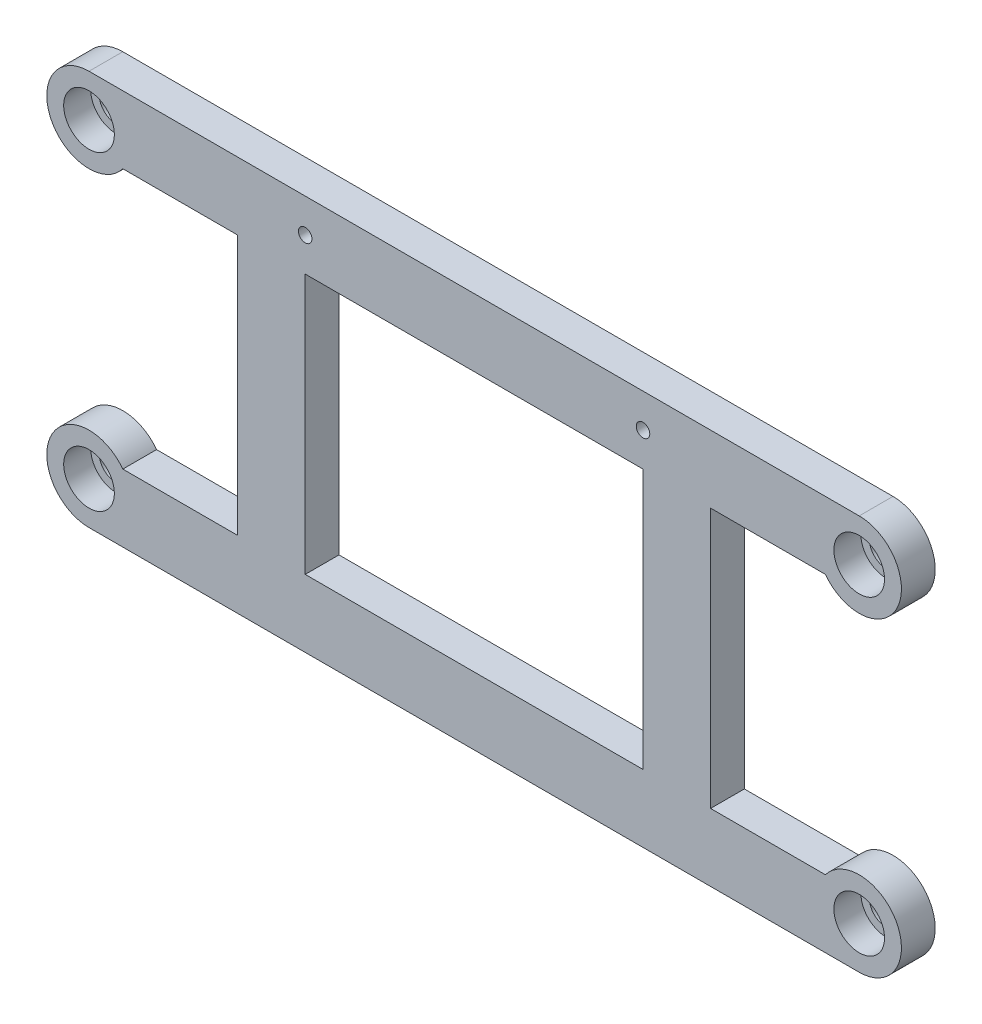
ISO-10303-21;
HEADER;
FILE_DESCRIPTION(('STEP AP214'),'2;1');
FILE_NAME('part.step','',(''),(''),'','','');
FILE_SCHEMA(('AUTOMOTIVE_DESIGN { 1 0 10303 214 1 1 1 1 }'));
ENDSEC;
DATA;
#1=APPLICATION_CONTEXT('core data for automotive mechanical design processes');
#2=APPLICATION_PROTOCOL_DEFINITION('international standard','automotive_design',2000,#1);
#3=PRODUCT_CONTEXT('',#1,'mechanical');
#4=PRODUCT('Part','Part','',(#3));
#5=PRODUCT_RELATED_PRODUCT_CATEGORY('part','',(#4));
#6=PRODUCT_DEFINITION_FORMATION('','',#4);
#7=PRODUCT_DEFINITION_CONTEXT('part definition',#1,'design');
#8=PRODUCT_DEFINITION('design','',#6,#7);
#9=PRODUCT_DEFINITION_SHAPE('','',#8);
#10=(LENGTH_UNIT() NAMED_UNIT(*) SI_UNIT(.MILLI.,.METRE.));
#11=(NAMED_UNIT(*) PLANE_ANGLE_UNIT() SI_UNIT($,.RADIAN.));
#12=(NAMED_UNIT(*) SI_UNIT($,.STERADIAN.) SOLID_ANGLE_UNIT());
#13=UNCERTAINTY_MEASURE_WITH_UNIT(LENGTH_MEASURE(1.E-05),#10,'distance_accuracy_value','');
#14=(GEOMETRIC_REPRESENTATION_CONTEXT(3) GLOBAL_UNCERTAINTY_ASSIGNED_CONTEXT((#13)) GLOBAL_UNIT_ASSIGNED_CONTEXT((#10,
#11,#12)) REPRESENTATION_CONTEXT('',''));
#15=CARTESIAN_POINT('',(0.,0.,0.));
#16=DIRECTION('',(0.,0.,1.));
#17=DIRECTION('',(1.,0.,0.));
#18=AXIS2_PLACEMENT_3D('',#15,#16,#17);
#19=CARTESIAN_POINT('',(114.,92.,10.));
#20=DIRECTION('',(0.,0.,-1.));
#21=DIRECTION('',(-1.,0.,0.));
#22=AXIS2_PLACEMENT_3D('',#19,#20,#21);
#23=PLANE('',#22);
#24=CARTESIAN_POINT('',(-50.,94.5,10.));
#25=DIRECTION('',(0.,0.,-1.));
#26=DIRECTION('',(-1.,0.,0.));
#27=AXIS2_PLACEMENT_3D('',#24,#25,#26);
#28=CIRCLE('',#27,2.);
#29=CARTESIAN_POINT('',(-52.,94.5,10.));
#30=VERTEX_POINT('',#29);
#31=EDGE_CURVE('E326',#30,#30,#28,.T.);
#32=ORIENTED_EDGE('',*,*,#31,.T.);
#33=EDGE_LOOP('',(#32));
#34=FACE_BOUND('',#33,.T.);
#35=CARTESIAN_POINT('',(50.,94.5,10.));
#36=DIRECTION('',(0.,0.,-1.));
#37=DIRECTION('',(-1.,0.,0.));
#38=AXIS2_PLACEMENT_3D('',#35,#36,#37);
#39=CIRCLE('',#38,2.);
#40=CARTESIAN_POINT('',(48.,94.5,10.));
#41=VERTEX_POINT('',#40);
#42=EDGE_CURVE('E320',#41,#41,#39,.T.);
#43=ORIENTED_EDGE('',*,*,#42,.T.);
#44=EDGE_LOOP('',(#43));
#45=FACE_BOUND('',#44,.T.);
#46=CARTESIAN_POINT('',(114.,92.,10.));
#47=DIRECTION('',(0.,0.,1.));
#48=DIRECTION('',(-1.,0.,0.));
#49=AXIS2_PLACEMENT_3D('',#46,#47,#48);
#50=CIRCLE('',#49,7.50000000000001);
#51=CARTESIAN_POINT('',(106.5,92.,10.));
#52=VERTEX_POINT('',#51);
#53=EDGE_CURVE('E306',#52,#52,#50,.T.);
#54=ORIENTED_EDGE('',*,*,#53,.F.);
#55=EDGE_LOOP('',(#54));
#56=FACE_BOUND('',#55,.T.);
#57=CARTESIAN_POINT('',(114.,0.,10.));
#58=DIRECTION('',(0.,0.,1.));
#59=DIRECTION('',(-1.,0.,0.));
#60=AXIS2_PLACEMENT_3D('',#57,#58,#59);
#61=CIRCLE('',#60,7.50000000000001);
#62=CARTESIAN_POINT('',(106.5,0.,10.));
#63=VERTEX_POINT('',#62);
#64=EDGE_CURVE('E305',#63,#63,#61,.T.);
#65=ORIENTED_EDGE('',*,*,#64,.F.);
#66=EDGE_LOOP('',(#65));
#67=FACE_BOUND('',#66,.T.);
#68=CARTESIAN_POINT('',(-114.,0.,10.));
#69=DIRECTION('',(0.,0.,1.));
#70=DIRECTION('',(1.,0.,0.));
#71=AXIS2_PLACEMENT_3D('',#68,#69,#70);
#72=CIRCLE('',#71,7.50000000000001);
#73=CARTESIAN_POINT('',(-106.5,0.,10.));
#74=VERTEX_POINT('',#73);
#75=EDGE_CURVE('E313',#74,#74,#72,.T.);
#76=ORIENTED_EDGE('',*,*,#75,.F.);
#77=EDGE_LOOP('',(#76));
#78=FACE_BOUND('',#77,.T.);
#79=CARTESIAN_POINT('',(-114.,92.,10.));
#80=DIRECTION('',(0.,0.,1.));
#81=DIRECTION('',(1.,0.,0.));
#82=AXIS2_PLACEMENT_3D('',#79,#80,#81);
#83=CIRCLE('',#82,7.50000000000001);
#84=CARTESIAN_POINT('',(-106.5,92.,10.));
#85=VERTEX_POINT('',#84);
#86=EDGE_CURVE('E298',#85,#85,#83,.T.);
#87=ORIENTED_EDGE('',*,*,#86,.F.);
#88=EDGE_LOOP('',(#87));
#89=FACE_BOUND('',#88,.T.);
#90=DIRECTION('',(-1.,0.,0.));
#91=VECTOR('',#90,1.);
#92=CARTESIAN_POINT('',(-64.,104.5,10.));
#93=LINE('',#92,#91);
#94=CARTESIAN_POINT('',(114.,104.5,10.));
#95=VERTEX_POINT('',#94);
#96=CARTESIAN_POINT('',(-114.,104.5,10.));
#97=VERTEX_POINT('',#96);
#98=EDGE_CURVE('E196',#95,#97,#93,.T.);
#99=ORIENTED_EDGE('',*,*,#98,.T.);
#100=CARTESIAN_POINT('',(-114.,92.,10.));
#101=DIRECTION('',(0.,0.,1.));
#102=DIRECTION('',(1.,0.,0.));
#103=AXIS2_PLACEMENT_3D('',#100,#101,#102);
#104=CIRCLE('',#103,12.5);
#105=CARTESIAN_POINT('',(-104.,84.5,10.));
#106=VERTEX_POINT('',#105);
#107=EDGE_CURVE('E198',#97,#106,#104,.T.);
#108=ORIENTED_EDGE('',*,*,#107,.T.);
#109=DIRECTION('',(1.,0.,0.));
#110=VECTOR('',#109,1.);
#111=CARTESIAN_POINT('',(-104.,84.5,10.));
#112=LINE('',#111,#110);
#113=CARTESIAN_POINT('',(-70.,84.5,10.));
#114=VERTEX_POINT('',#113);
#115=EDGE_CURVE('E201',#106,#114,#112,.T.);
#116=ORIENTED_EDGE('',*,*,#115,.T.);
#117=DIRECTION('',(0.,-1.,0.));
#118=VECTOR('',#117,1.);
#119=CARTESIAN_POINT('',(-70.,84.5,10.));
#120=LINE('',#119,#118);
#121=CARTESIAN_POINT('',(-70.,7.5,10.));
#122=VERTEX_POINT('',#121);
#123=EDGE_CURVE('E203',#114,#122,#120,.T.);
#124=ORIENTED_EDGE('',*,*,#123,.T.);
#125=DIRECTION('',(-1.,0.,0.));
#126=VECTOR('',#125,1.);
#127=CARTESIAN_POINT('',(-104.,7.5,10.));
#128=LINE('',#127,#126);
#129=CARTESIAN_POINT('',(-104.,7.5,10.));
#130=VERTEX_POINT('',#129);
#131=EDGE_CURVE('E205',#122,#130,#128,.T.);
#132=ORIENTED_EDGE('',*,*,#131,.T.);
#133=CARTESIAN_POINT('',(-114.,0.,10.));
#134=DIRECTION('',(0.,0.,1.));
#135=DIRECTION('',(1.,0.,0.));
#136=AXIS2_PLACEMENT_3D('',#133,#134,#135);
#137=CIRCLE('',#136,12.5);
#138=CARTESIAN_POINT('',(-114.,-12.5,10.));
#139=VERTEX_POINT('',#138);
#140=EDGE_CURVE('E207',#130,#139,#137,.T.);
#141=ORIENTED_EDGE('',*,*,#140,.T.);
#142=DIRECTION('',(1.,0.,0.));
#143=VECTOR('',#142,1.);
#144=CARTESIAN_POINT('',(114.,-12.5,10.));
#145=LINE('',#144,#143);
#146=CARTESIAN_POINT('',(114.,-12.5,10.));
#147=VERTEX_POINT('',#146);
#148=EDGE_CURVE('E209',#139,#147,#145,.T.);
#149=ORIENTED_EDGE('',*,*,#148,.T.);
#150=CARTESIAN_POINT('',(114.,0.,10.));
#151=DIRECTION('',(0.,0.,1.));
#152=DIRECTION('',(-1.,0.,0.));
#153=AXIS2_PLACEMENT_3D('',#150,#151,#152);
#154=CIRCLE('',#153,12.5);
#155=CARTESIAN_POINT('',(104.,7.50000000000003,10.));
#156=VERTEX_POINT('',#155);
#157=EDGE_CURVE('E211',#147,#156,#154,.T.);
#158=ORIENTED_EDGE('',*,*,#157,.T.);
#159=DIRECTION('',(-1.,0.,0.));
#160=VECTOR('',#159,1.);
#161=CARTESIAN_POINT('',(104.,7.50000000000003,10.));
#162=LINE('',#161,#160);
#163=CARTESIAN_POINT('',(70.,7.50000000000002,10.));
#164=VERTEX_POINT('',#163);
#165=EDGE_CURVE('E213',#156,#164,#162,.T.);
#166=ORIENTED_EDGE('',*,*,#165,.T.);
#167=DIRECTION('',(0.,1.,0.));
#168=VECTOR('',#167,1.);
#169=CARTESIAN_POINT('',(70.,84.5,10.));
#170=LINE('',#169,#168);
#171=CARTESIAN_POINT('',(70.,84.5,10.));
#172=VERTEX_POINT('',#171);
#173=EDGE_CURVE('E215',#164,#172,#170,.T.);
#174=ORIENTED_EDGE('',*,*,#173,.T.);
#175=DIRECTION('',(1.,0.,0.));
#176=VECTOR('',#175,1.);
#177=CARTESIAN_POINT('',(104.,84.5,10.));
#178=LINE('',#177,#176);
#179=CARTESIAN_POINT('',(104.,84.5,10.));
#180=VERTEX_POINT('',#179);
#181=EDGE_CURVE('E217',#172,#180,#178,.T.);
#182=ORIENTED_EDGE('',*,*,#181,.T.);
#183=CARTESIAN_POINT('',(114.,92.,10.));
#184=DIRECTION('',(0.,0.,1.));
#185=DIRECTION('',(-1.,0.,0.));
#186=AXIS2_PLACEMENT_3D('',#183,#184,#185);
#187=CIRCLE('',#186,12.5);
#188=EDGE_CURVE('E219',#180,#95,#187,.T.);
#189=ORIENTED_EDGE('',*,*,#188,.T.);
#190=EDGE_LOOP('',(#99,#108,#116,#124,#132,#141,#149,#158,#166,#174,#182,#189));
#191=FACE_BOUND('',#190,.T.);
#192=DIRECTION('',(0.,-1.,0.));
#193=VECTOR('',#192,1.);
#194=CARTESIAN_POINT('',(-50.,84.5,10.));
#195=LINE('',#194,#193);
#196=CARTESIAN_POINT('',(-50.,84.5,10.));
#197=VERTEX_POINT('',#196);
#198=CARTESIAN_POINT('',(-50.,7.50000000000001,10.));
#199=VERTEX_POINT('',#198);
#200=EDGE_CURVE('E152',#197,#199,#195,.T.);
#201=ORIENTED_EDGE('',*,*,#200,.F.);
#202=DIRECTION('',(-1.,0.,0.));
#203=VECTOR('',#202,1.);
#204=CARTESIAN_POINT('',(-50.,84.5,10.));
#205=LINE('',#204,#203);
#206=CARTESIAN_POINT('',(50.,84.5,10.));
#207=VERTEX_POINT('',#206);
#208=EDGE_CURVE('E174',#207,#197,#205,.T.);
#209=ORIENTED_EDGE('',*,*,#208,.F.);
#210=DIRECTION('',(0.,1.,0.));
#211=VECTOR('',#210,1.);
#212=CARTESIAN_POINT('',(50.,84.5,10.));
#213=LINE('',#212,#211);
#214=CARTESIAN_POINT('',(50.,7.50000000000002,10.));
#215=VERTEX_POINT('',#214);
#216=EDGE_CURVE('E172',#215,#207,#213,.T.);
#217=ORIENTED_EDGE('',*,*,#216,.F.);
#218=DIRECTION('',(1.,0.,0.));
#219=VECTOR('',#218,1.);
#220=CARTESIAN_POINT('',(-50.,7.50000000000001,10.));
#221=LINE('',#220,#219);
#222=EDGE_CURVE('E160',#199,#215,#221,.T.);
#223=ORIENTED_EDGE('',*,*,#222,.F.);
#224=EDGE_LOOP('',(#201,#209,#217,#223));
#225=FACE_BOUND('',#224,.T.);
#226=ADVANCED_FACE('F37',(#34,#45,#56,#67,#78,#89,#191,#225),#23,.F.);
#227=CARTESIAN_POINT('',(114.,92.,0.));
#228=DIRECTION('',(0.,0.,-1.));
#229=DIRECTION('',(-1.,0.,0.));
#230=AXIS2_PLACEMENT_3D('',#227,#228,#229);
#231=PLANE('',#230);
#232=CARTESIAN_POINT('',(-50.,94.5,0.));
#233=DIRECTION('',(0.,0.,1.));
#234=DIRECTION('',(1.,0.,0.));
#235=AXIS2_PLACEMENT_3D('',#232,#233,#234);
#236=CIRCLE('',#235,2.);
#237=CARTESIAN_POINT('',(-48.,94.5,0.));
#238=VERTEX_POINT('',#237);
#239=EDGE_CURVE('E309',#238,#238,#236,.T.);
#240=ORIENTED_EDGE('',*,*,#239,.T.);
#241=EDGE_LOOP('',(#240));
#242=FACE_BOUND('',#241,.T.);
#243=CARTESIAN_POINT('',(50.,94.5,0.));
#244=DIRECTION('',(0.,0.,1.));
#245=DIRECTION('',(-1.,0.,0.));
#246=AXIS2_PLACEMENT_3D('',#243,#244,#245);
#247=CIRCLE('',#246,2.);
#248=CARTESIAN_POINT('',(48.,94.5,0.));
#249=VERTEX_POINT('',#248);
#250=EDGE_CURVE('E323',#249,#249,#247,.T.);
#251=ORIENTED_EDGE('',*,*,#250,.T.);
#252=EDGE_LOOP('',(#251));
#253=FACE_BOUND('',#252,.T.);
#254=CARTESIAN_POINT('',(114.,92.,0.));
#255=DIRECTION('',(0.,0.,1.));
#256=DIRECTION('',(-1.,0.,0.));
#257=AXIS2_PLACEMENT_3D('',#254,#255,#256);
#258=CIRCLE('',#257,5.00000000000001);
#259=CARTESIAN_POINT('',(109.,92.,0.));
#260=VERTEX_POINT('',#259);
#261=EDGE_CURVE('E180',#260,#260,#258,.T.);
#262=ORIENTED_EDGE('',*,*,#261,.T.);
#263=EDGE_LOOP('',(#262));
#264=FACE_BOUND('',#263,.T.);
#265=CARTESIAN_POINT('',(-114.,0.,0.));
#266=DIRECTION('',(0.,0.,1.));
#267=DIRECTION('',(1.,0.,0.));
#268=AXIS2_PLACEMENT_3D('',#265,#266,#267);
#269=CIRCLE('',#268,5.);
#270=CARTESIAN_POINT('',(-109.,0.,0.));
#271=VERTEX_POINT('',#270);
#272=EDGE_CURVE('E192',#271,#271,#269,.T.);
#273=ORIENTED_EDGE('',*,*,#272,.T.);
#274=EDGE_LOOP('',(#273));
#275=FACE_BOUND('',#274,.T.);
#276=CARTESIAN_POINT('',(-114.,92.,0.));
#277=DIRECTION('',(0.,0.,1.));
#278=DIRECTION('',(1.,0.,0.));
#279=AXIS2_PLACEMENT_3D('',#276,#277,#278);
#280=CIRCLE('',#279,12.5);
#281=CARTESIAN_POINT('',(-114.,104.5,0.));
#282=VERTEX_POINT('',#281);
#283=CARTESIAN_POINT('',(-104.,84.5,0.));
#284=VERTEX_POINT('',#283);
#285=EDGE_CURVE('E195',#282,#284,#280,.T.);
#286=ORIENTED_EDGE('',*,*,#285,.F.);
#287=DIRECTION('',(-1.,0.,0.));
#288=VECTOR('',#287,1.);
#289=CARTESIAN_POINT('',(114.,104.5,0.));
#290=LINE('',#289,#288);
#291=CARTESIAN_POINT('',(114.,104.5,0.));
#292=VERTEX_POINT('',#291);
#293=EDGE_CURVE('E199',#292,#282,#290,.T.);
#294=ORIENTED_EDGE('',*,*,#293,.F.);
#295=CARTESIAN_POINT('',(114.,92.,0.));
#296=DIRECTION('',(0.,0.,1.));
#297=DIRECTION('',(-1.,0.,0.));
#298=AXIS2_PLACEMENT_3D('',#295,#296,#297);
#299=CIRCLE('',#298,12.5);
#300=CARTESIAN_POINT('',(104.,84.5,0.));
#301=VERTEX_POINT('',#300);
#302=EDGE_CURVE('E242',#301,#292,#299,.T.);
#303=ORIENTED_EDGE('',*,*,#302,.F.);
#304=DIRECTION('',(1.,0.,0.));
#305=VECTOR('',#304,1.);
#306=CARTESIAN_POINT('',(104.,84.5,0.));
#307=LINE('',#306,#305);
#308=CARTESIAN_POINT('',(70.,84.5,0.));
#309=VERTEX_POINT('',#308);
#310=EDGE_CURVE('E240',#309,#301,#307,.T.);
#311=ORIENTED_EDGE('',*,*,#310,.F.);
#312=DIRECTION('',(0.,1.,0.));
#313=VECTOR('',#312,1.);
#314=CARTESIAN_POINT('',(70.,84.5,0.));
#315=LINE('',#314,#313);
#316=CARTESIAN_POINT('',(70.,7.50000000000002,0.));
#317=VERTEX_POINT('',#316);
#318=EDGE_CURVE('E238',#317,#309,#315,.T.);
#319=ORIENTED_EDGE('',*,*,#318,.F.);
#320=DIRECTION('',(-1.,0.,0.));
#321=VECTOR('',#320,1.);
#322=CARTESIAN_POINT('',(104.,7.50000000000003,0.));
#323=LINE('',#322,#321);
#324=CARTESIAN_POINT('',(104.,7.50000000000003,0.));
#325=VERTEX_POINT('',#324);
#326=EDGE_CURVE('E236',#325,#317,#323,.T.);
#327=ORIENTED_EDGE('',*,*,#326,.F.);
#328=CARTESIAN_POINT('',(114.,0.,0.));
#329=DIRECTION('',(0.,0.,1.));
#330=DIRECTION('',(-1.,0.,0.));
#331=AXIS2_PLACEMENT_3D('',#328,#329,#330);
#332=CIRCLE('',#331,12.5);
#333=CARTESIAN_POINT('',(114.,-12.5,0.));
#334=VERTEX_POINT('',#333);
#335=EDGE_CURVE('E234',#334,#325,#332,.T.);
#336=ORIENTED_EDGE('',*,*,#335,.F.);
#337=DIRECTION('',(1.,0.,0.));
#338=VECTOR('',#337,1.);
#339=CARTESIAN_POINT('',(114.,-12.5,0.));
#340=LINE('',#339,#338);
#341=CARTESIAN_POINT('',(-114.,-12.5,0.));
#342=VERTEX_POINT('',#341);
#343=EDGE_CURVE('E232',#342,#334,#340,.T.);
#344=ORIENTED_EDGE('',*,*,#343,.F.);
#345=CARTESIAN_POINT('',(-114.,0.,0.));
#346=DIRECTION('',(0.,0.,1.));
#347=DIRECTION('',(1.,0.,0.));
#348=AXIS2_PLACEMENT_3D('',#345,#346,#347);
#349=CIRCLE('',#348,12.5);
#350=CARTESIAN_POINT('',(-104.,7.5,0.));
#351=VERTEX_POINT('',#350);
#352=EDGE_CURVE('E230',#351,#342,#349,.T.);
#353=ORIENTED_EDGE('',*,*,#352,.F.);
#354=DIRECTION('',(-1.,0.,0.));
#355=VECTOR('',#354,1.);
#356=CARTESIAN_POINT('',(-104.,7.5,0.));
#357=LINE('',#356,#355);
#358=CARTESIAN_POINT('',(-70.,7.5,0.));
#359=VERTEX_POINT('',#358);
#360=EDGE_CURVE('E228',#359,#351,#357,.T.);
#361=ORIENTED_EDGE('',*,*,#360,.F.);
#362=DIRECTION('',(0.,-1.,0.));
#363=VECTOR('',#362,1.);
#364=CARTESIAN_POINT('',(-70.,84.5,0.));
#365=LINE('',#364,#363);
#366=CARTESIAN_POINT('',(-70.,84.5,0.));
#367=VERTEX_POINT('',#366);
#368=EDGE_CURVE('E226',#367,#359,#365,.T.);
#369=ORIENTED_EDGE('',*,*,#368,.F.);
#370=DIRECTION('',(1.,0.,0.));
#371=VECTOR('',#370,1.);
#372=CARTESIAN_POINT('',(-104.,84.5,0.));
#373=LINE('',#372,#371);
#374=EDGE_CURVE('E224',#284,#367,#373,.T.);
#375=ORIENTED_EDGE('',*,*,#374,.F.);
#376=EDGE_LOOP('',(#286,#294,#303,#311,#319,#327,#336,#344,#353,#361,#369,#375));
#377=FACE_BOUND('',#376,.T.);
#378=CARTESIAN_POINT('',(-114.,92.,0.));
#379=DIRECTION('',(0.,0.,1.));
#380=DIRECTION('',(1.,0.,0.));
#381=AXIS2_PLACEMENT_3D('',#378,#379,#380);
#382=CIRCLE('',#381,5.00000000000001);
#383=CARTESIAN_POINT('',(-109.,92.,0.));
#384=VERTEX_POINT('',#383);
#385=EDGE_CURVE('E168',#384,#384,#382,.T.);
#386=ORIENTED_EDGE('',*,*,#385,.T.);
#387=EDGE_LOOP('',(#386));
#388=FACE_BOUND('',#387,.T.);
#389=DIRECTION('',(-1.,0.,0.));
#390=VECTOR('',#389,1.);
#391=CARTESIAN_POINT('',(-50.,84.5,0.));
#392=LINE('',#391,#390);
#393=CARTESIAN_POINT('',(50.,84.5,0.));
#394=VERTEX_POINT('',#393);
#395=CARTESIAN_POINT('',(-50.,84.5,0.));
#396=VERTEX_POINT('',#395);
#397=EDGE_CURVE('E161',#394,#396,#392,.T.);
#398=ORIENTED_EDGE('',*,*,#397,.T.);
#399=DIRECTION('',(0.,-1.,0.));
#400=VECTOR('',#399,1.);
#401=CARTESIAN_POINT('',(-50.,84.5,0.));
#402=LINE('',#401,#400);
#403=CARTESIAN_POINT('',(-50.,7.50000000000001,0.));
#404=VERTEX_POINT('',#403);
#405=EDGE_CURVE('E62',#396,#404,#402,.T.);
#406=ORIENTED_EDGE('',*,*,#405,.T.);
#407=DIRECTION('',(1.,0.,0.));
#408=VECTOR('',#407,1.);
#409=CARTESIAN_POINT('',(-50.,7.50000000000001,0.));
#410=LINE('',#409,#408);
#411=CARTESIAN_POINT('',(50.,7.50000000000002,0.));
#412=VERTEX_POINT('',#411);
#413=EDGE_CURVE('E167',#404,#412,#410,.T.);
#414=ORIENTED_EDGE('',*,*,#413,.T.);
#415=DIRECTION('',(0.,1.,0.));
#416=VECTOR('',#415,1.);
#417=CARTESIAN_POINT('',(50.,84.5,0.));
#418=LINE('',#417,#416);
#419=EDGE_CURVE('E182',#412,#394,#418,.T.);
#420=ORIENTED_EDGE('',*,*,#419,.T.);
#421=EDGE_LOOP('',(#398,#406,#414,#420));
#422=FACE_BOUND('',#421,.T.);
#423=CARTESIAN_POINT('',(114.,0.,0.));
#424=DIRECTION('',(0.,0.,1.));
#425=DIRECTION('',(-1.,0.,0.));
#426=AXIS2_PLACEMENT_3D('',#423,#424,#425);
#427=CIRCLE('',#426,5.);
#428=CARTESIAN_POINT('',(109.,0.,0.));
#429=VERTEX_POINT('',#428);
#430=EDGE_CURVE('E287',#429,#429,#427,.T.);
#431=ORIENTED_EDGE('',*,*,#430,.T.);
#432=EDGE_LOOP('',(#431));
#433=FACE_BOUND('',#432,.T.);
#434=ADVANCED_FACE('F332',(#242,#253,#264,#275,#377,#388,#422,#433),#231,.T.);
#435=CARTESIAN_POINT('',(-114.,92.,10.));
#436=DIRECTION('',(0.,0.,-1.));
#437=DIRECTION('',(-1.,0.,0.));
#438=AXIS2_PLACEMENT_3D('',#435,#436,#437);
#439=CYLINDRICAL_SURFACE('',#438,12.5);
#440=ORIENTED_EDGE('',*,*,#285,.T.);
#441=DIRECTION('',(0.,0.,-1.));
#442=VECTOR('',#441,1.);
#443=CARTESIAN_POINT('',(-104.,84.5,10.));
#444=LINE('',#443,#442);
#445=EDGE_CURVE('E46',#106,#284,#444,.T.);
#446=ORIENTED_EDGE('',*,*,#445,.F.);
#447=ORIENTED_EDGE('',*,*,#107,.F.);
#448=DIRECTION('',(0.,0.,-1.));
#449=VECTOR('',#448,1.);
#450=CARTESIAN_POINT('',(-114.,104.5,10.));
#451=LINE('',#450,#449);
#452=EDGE_CURVE('E12',#97,#282,#451,.T.);
#453=ORIENTED_EDGE('',*,*,#452,.T.);
#454=EDGE_LOOP('',(#440,#446,#447,#453));
#455=FACE_BOUND('',#454,.T.);
#456=ADVANCED_FACE('F39',(#455),#439,.T.);
#457=CARTESIAN_POINT('',(-104.,84.5,10.));
#458=DIRECTION('',(0.,1.,0.));
#459=DIRECTION('',(0.,0.,1.));
#460=AXIS2_PLACEMENT_3D('',#457,#458,#459);
#461=PLANE('',#460);
#462=ORIENTED_EDGE('',*,*,#374,.T.);
#463=DIRECTION('',(0.,0.,-1.));
#464=VECTOR('',#463,1.);
#465=CARTESIAN_POINT('',(-70.,84.5,10.));
#466=LINE('',#465,#464);
#467=EDGE_CURVE('E271',#114,#367,#466,.T.);
#468=ORIENTED_EDGE('',*,*,#467,.F.);
#469=ORIENTED_EDGE('',*,*,#115,.F.);
#470=ORIENTED_EDGE('',*,*,#445,.T.);
#471=EDGE_LOOP('',(#462,#468,#469,#470));
#472=FACE_BOUND('',#471,.T.);
#473=ADVANCED_FACE('F369',(#472),#461,.F.);
#474=CARTESIAN_POINT('',(-70.,84.5,10.));
#475=DIRECTION('',(1.,0.,0.));
#476=DIRECTION('',(0.,1.,0.));
#477=AXIS2_PLACEMENT_3D('',#474,#475,#476);
#478=PLANE('',#477);
#479=ORIENTED_EDGE('',*,*,#368,.T.);
#480=DIRECTION('',(0.,0.,-1.));
#481=VECTOR('',#480,1.);
#482=CARTESIAN_POINT('',(-70.,7.5,10.));
#483=LINE('',#482,#481);
#484=EDGE_CURVE('E268',#122,#359,#483,.T.);
#485=ORIENTED_EDGE('',*,*,#484,.F.);
#486=ORIENTED_EDGE('',*,*,#123,.F.);
#487=ORIENTED_EDGE('',*,*,#467,.T.);
#488=EDGE_LOOP('',(#479,#485,#486,#487));
#489=FACE_BOUND('',#488,.T.);
#490=ADVANCED_FACE('F375',(#489),#478,.F.);
#491=CARTESIAN_POINT('',(-104.,7.5,10.));
#492=DIRECTION('',(0.,-1.,0.));
#493=DIRECTION('',(1.,0.,0.));
#494=AXIS2_PLACEMENT_3D('',#491,#492,#493);
#495=PLANE('',#494);
#496=ORIENTED_EDGE('',*,*,#360,.T.);
#497=DIRECTION('',(0.,0.,-1.));
#498=VECTOR('',#497,1.);
#499=CARTESIAN_POINT('',(-104.,7.5,10.));
#500=LINE('',#499,#498);
#501=EDGE_CURVE('E265',#130,#351,#500,.T.);
#502=ORIENTED_EDGE('',*,*,#501,.F.);
#503=ORIENTED_EDGE('',*,*,#131,.F.);
#504=ORIENTED_EDGE('',*,*,#484,.T.);
#505=EDGE_LOOP('',(#496,#502,#503,#504));
#506=FACE_BOUND('',#505,.T.);
#507=ADVANCED_FACE('F379',(#506),#495,.F.);
#508=CARTESIAN_POINT('',(-114.,0.,10.));
#509=DIRECTION('',(0.,0.,-1.));
#510=DIRECTION('',(-1.,0.,0.));
#511=AXIS2_PLACEMENT_3D('',#508,#509,#510);
#512=CYLINDRICAL_SURFACE('',#511,12.5);
#513=ORIENTED_EDGE('',*,*,#352,.T.);
#514=DIRECTION('',(0.,0.,-1.));
#515=VECTOR('',#514,1.);
#516=CARTESIAN_POINT('',(-114.,-12.5,10.));
#517=LINE('',#516,#515);
#518=EDGE_CURVE('E262',#139,#342,#517,.T.);
#519=ORIENTED_EDGE('',*,*,#518,.F.);
#520=ORIENTED_EDGE('',*,*,#140,.F.);
#521=ORIENTED_EDGE('',*,*,#501,.T.);
#522=EDGE_LOOP('',(#513,#519,#520,#521));
#523=FACE_BOUND('',#522,.T.);
#524=ADVANCED_FACE('F384',(#523),#512,.T.);
#525=CARTESIAN_POINT('',(114.,-12.5,10.));
#526=DIRECTION('',(0.,1.,0.));
#527=DIRECTION('',(0.,0.,1.));
#528=AXIS2_PLACEMENT_3D('',#525,#526,#527);
#529=PLANE('',#528);
#530=ORIENTED_EDGE('',*,*,#343,.T.);
#531=DIRECTION('',(0.,0.,-1.));
#532=VECTOR('',#531,1.);
#533=CARTESIAN_POINT('',(114.,-12.5,10.));
#534=LINE('',#533,#532);
#535=EDGE_CURVE('E259',#147,#334,#534,.T.);
#536=ORIENTED_EDGE('',*,*,#535,.F.);
#537=ORIENTED_EDGE('',*,*,#148,.F.);
#538=ORIENTED_EDGE('',*,*,#518,.T.);
#539=EDGE_LOOP('',(#530,#536,#537,#538));
#540=FACE_BOUND('',#539,.T.);
#541=ADVANCED_FACE('F390',(#540),#529,.F.);
#542=CARTESIAN_POINT('',(114.,0.,10.));
#543=DIRECTION('',(0.,0.,-1.));
#544=DIRECTION('',(-1.,0.,0.));
#545=AXIS2_PLACEMENT_3D('',#542,#543,#544);
#546=CYLINDRICAL_SURFACE('',#545,12.5);
#547=ORIENTED_EDGE('',*,*,#335,.T.);
#548=DIRECTION('',(0.,0.,-1.));
#549=VECTOR('',#548,1.);
#550=CARTESIAN_POINT('',(104.,7.50000000000003,10.));
#551=LINE('',#550,#549);
#552=EDGE_CURVE('E256',#156,#325,#551,.T.);
#553=ORIENTED_EDGE('',*,*,#552,.F.);
#554=ORIENTED_EDGE('',*,*,#157,.F.);
#555=ORIENTED_EDGE('',*,*,#535,.T.);
#556=EDGE_LOOP('',(#547,#553,#554,#555));
#557=FACE_BOUND('',#556,.T.);
#558=ADVANCED_FACE('F394',(#557),#546,.T.);
#559=CARTESIAN_POINT('',(104.,7.50000000000003,10.));
#560=DIRECTION('',(0.,-1.,0.));
#561=DIRECTION('',(1.,0.,0.));
#562=AXIS2_PLACEMENT_3D('',#559,#560,#561);
#563=PLANE('',#562);
#564=ORIENTED_EDGE('',*,*,#326,.T.);
#565=DIRECTION('',(0.,0.,-1.));
#566=VECTOR('',#565,1.);
#567=CARTESIAN_POINT('',(70.,7.50000000000002,10.));
#568=LINE('',#567,#566);
#569=EDGE_CURVE('E253',#164,#317,#568,.T.);
#570=ORIENTED_EDGE('',*,*,#569,.F.);
#571=ORIENTED_EDGE('',*,*,#165,.F.);
#572=ORIENTED_EDGE('',*,*,#552,.T.);
#573=EDGE_LOOP('',(#564,#570,#571,#572));
#574=FACE_BOUND('',#573,.T.);
#575=ADVANCED_FACE('F399',(#574),#563,.F.);
#576=CARTESIAN_POINT('',(70.,84.5,10.));
#577=DIRECTION('',(-1.,0.,0.));
#578=DIRECTION('',(0.,-1.,0.));
#579=AXIS2_PLACEMENT_3D('',#576,#577,#578);
#580=PLANE('',#579);
#581=ORIENTED_EDGE('',*,*,#318,.T.);
#582=DIRECTION('',(0.,0.,-1.));
#583=VECTOR('',#582,1.);
#584=CARTESIAN_POINT('',(70.,84.5,10.));
#585=LINE('',#584,#583);
#586=EDGE_CURVE('E250',#172,#309,#585,.T.);
#587=ORIENTED_EDGE('',*,*,#586,.F.);
#588=ORIENTED_EDGE('',*,*,#173,.F.);
#589=ORIENTED_EDGE('',*,*,#569,.T.);
#590=EDGE_LOOP('',(#581,#587,#588,#589));
#591=FACE_BOUND('',#590,.T.);
#592=ADVANCED_FACE('F405',(#591),#580,.F.);
#593=CARTESIAN_POINT('',(104.,84.5,10.));
#594=DIRECTION('',(0.,1.,0.));
#595=DIRECTION('',(-1.,0.,0.));
#596=AXIS2_PLACEMENT_3D('',#593,#594,#595);
#597=PLANE('',#596);
#598=ORIENTED_EDGE('',*,*,#310,.T.);
#599=DIRECTION('',(0.,0.,-1.));
#600=VECTOR('',#599,1.);
#601=CARTESIAN_POINT('',(104.,84.5,10.));
#602=LINE('',#601,#600);
#603=EDGE_CURVE('E247',#180,#301,#602,.T.);
#604=ORIENTED_EDGE('',*,*,#603,.F.);
#605=ORIENTED_EDGE('',*,*,#181,.F.);
#606=ORIENTED_EDGE('',*,*,#586,.T.);
#607=EDGE_LOOP('',(#598,#604,#605,#606));
#608=FACE_BOUND('',#607,.T.);
#609=ADVANCED_FACE('F409',(#608),#597,.F.);
#610=CARTESIAN_POINT('',(114.,92.,10.));
#611=DIRECTION('',(0.,0.,-1.));
#612=DIRECTION('',(-1.,0.,0.));
#613=AXIS2_PLACEMENT_3D('',#610,#611,#612);
#614=CYLINDRICAL_SURFACE('',#613,12.5);
#615=ORIENTED_EDGE('',*,*,#302,.T.);
#616=DIRECTION('',(0.,0.,-1.));
#617=VECTOR('',#616,1.);
#618=CARTESIAN_POINT('',(114.,104.5,10.));
#619=LINE('',#618,#617);
#620=EDGE_CURVE('E222',#95,#292,#619,.T.);
#621=ORIENTED_EDGE('',*,*,#620,.F.);
#622=ORIENTED_EDGE('',*,*,#188,.F.);
#623=ORIENTED_EDGE('',*,*,#603,.T.);
#624=EDGE_LOOP('',(#615,#621,#622,#623));
#625=FACE_BOUND('',#624,.T.);
#626=ADVANCED_FACE('F412',(#625),#614,.T.);
#627=CARTESIAN_POINT('',(114.,104.5,10.));
#628=DIRECTION('',(0.,-1.,0.));
#629=DIRECTION('',(1.,0.,0.));
#630=AXIS2_PLACEMENT_3D('',#627,#628,#629);
#631=PLANE('',#630);
#632=ORIENTED_EDGE('',*,*,#293,.T.);
#633=ORIENTED_EDGE('',*,*,#452,.F.);
#634=ORIENTED_EDGE('',*,*,#98,.F.);
#635=ORIENTED_EDGE('',*,*,#620,.T.);
#636=EDGE_LOOP('',(#632,#633,#634,#635));
#637=FACE_BOUND('',#636,.T.);
#638=ADVANCED_FACE('F361',(#637),#631,.F.);
#639=CARTESIAN_POINT('',(-114.,0.,10.));
#640=DIRECTION('',(0.,0.,-1.));
#641=DIRECTION('',(-1.,0.,0.));
#642=AXIS2_PLACEMENT_3D('',#639,#640,#641);
#643=CYLINDRICAL_SURFACE('',#642,5.);
#644=CARTESIAN_POINT('',(-114.,0.,2.));
#645=DIRECTION('',(0.,0.,-1.));
#646=DIRECTION('',(-1.,0.,0.));
#647=AXIS2_PLACEMENT_3D('',#644,#645,#646);
#648=CIRCLE('',#647,5.);
#649=CARTESIAN_POINT('',(-119.,0.,2.));
#650=VERTEX_POINT('',#649);
#651=EDGE_CURVE('E41',#650,#650,#648,.T.);
#652=ORIENTED_EDGE('',*,*,#651,.F.);
#653=EDGE_LOOP('',(#652));
#654=FACE_BOUND('',#653,.T.);
#655=ORIENTED_EDGE('',*,*,#272,.F.);
#656=EDGE_LOOP('',(#655));
#657=FACE_BOUND('',#656,.T.);
#658=ADVANCED_FACE('F443',(#654,#657),#643,.F.);
#659=CARTESIAN_POINT('',(-114.,92.,10.));
#660=DIRECTION('',(0.,0.,-1.));
#661=DIRECTION('',(-1.,0.,0.));
#662=AXIS2_PLACEMENT_3D('',#659,#660,#661);
#663=CYLINDRICAL_SURFACE('',#662,5.00000000000001);
#664=CARTESIAN_POINT('',(-114.,92.,2.));
#665=DIRECTION('',(0.,0.,-1.));
#666=DIRECTION('',(-1.,0.,0.));
#667=AXIS2_PLACEMENT_3D('',#664,#665,#666);
#668=CIRCLE('',#667,5.00000000000001);
#669=CARTESIAN_POINT('',(-119.,92.,2.));
#670=VERTEX_POINT('',#669);
#671=EDGE_CURVE('E282',#670,#670,#668,.T.);
#672=ORIENTED_EDGE('',*,*,#671,.F.);
#673=EDGE_LOOP('',(#672));
#674=FACE_BOUND('',#673,.T.);
#675=ORIENTED_EDGE('',*,*,#385,.F.);
#676=EDGE_LOOP('',(#675));
#677=FACE_BOUND('',#676,.T.);
#678=ADVANCED_FACE('F440',(#674,#677),#663,.F.);
#679=CARTESIAN_POINT('',(-50.,84.5,10.));
#680=DIRECTION('',(1.,0.,0.));
#681=DIRECTION('',(0.,1.,0.));
#682=AXIS2_PLACEMENT_3D('',#679,#680,#681);
#683=PLANE('',#682);
#684=ORIENTED_EDGE('',*,*,#405,.F.);
#685=DIRECTION('',(0.,0.,-1.));
#686=VECTOR('',#685,1.);
#687=CARTESIAN_POINT('',(-50.,84.5,10.));
#688=LINE('',#687,#686);
#689=EDGE_CURVE('E156',#197,#396,#688,.T.);
#690=ORIENTED_EDGE('',*,*,#689,.F.);
#691=ORIENTED_EDGE('',*,*,#200,.T.);
#692=DIRECTION('',(0.,0.,-1.));
#693=VECTOR('',#692,1.);
#694=CARTESIAN_POINT('',(-50.,7.50000000000001,10.));
#695=LINE('',#694,#693);
#696=EDGE_CURVE('E155',#199,#404,#695,.T.);
#697=ORIENTED_EDGE('',*,*,#696,.T.);
#698=EDGE_LOOP('',(#684,#690,#691,#697));
#699=FACE_BOUND('',#698,.T.);
#700=ADVANCED_FACE('F154',(#699),#683,.T.);
#701=CARTESIAN_POINT('',(-50.,7.50000000000001,10.));
#702=DIRECTION('',(0.,1.,0.));
#703=DIRECTION('',(-1.,0.,0.));
#704=AXIS2_PLACEMENT_3D('',#701,#702,#703);
#705=PLANE('',#704);
#706=ORIENTED_EDGE('',*,*,#413,.F.);
#707=ORIENTED_EDGE('',*,*,#696,.F.);
#708=ORIENTED_EDGE('',*,*,#222,.T.);
#709=DIRECTION('',(0.,0.,-1.));
#710=VECTOR('',#709,1.);
#711=CARTESIAN_POINT('',(50.,7.50000000000002,10.));
#712=LINE('',#711,#710);
#713=EDGE_CURVE('E169',#215,#412,#712,.T.);
#714=ORIENTED_EDGE('',*,*,#713,.T.);
#715=EDGE_LOOP('',(#706,#707,#708,#714));
#716=FACE_BOUND('',#715,.T.);
#717=ADVANCED_FACE('F164',(#716),#705,.T.);
#718=CARTESIAN_POINT('',(50.,84.5,10.));
#719=DIRECTION('',(-1.,0.,0.));
#720=DIRECTION('',(0.,-1.,0.));
#721=AXIS2_PLACEMENT_3D('',#718,#719,#720);
#722=PLANE('',#721);
#723=ORIENTED_EDGE('',*,*,#419,.F.);
#724=ORIENTED_EDGE('',*,*,#713,.F.);
#725=ORIENTED_EDGE('',*,*,#216,.T.);
#726=DIRECTION('',(0.,0.,-1.));
#727=VECTOR('',#726,1.);
#728=CARTESIAN_POINT('',(50.,84.5,10.));
#729=LINE('',#728,#727);
#730=EDGE_CURVE('E54',#207,#394,#729,.T.);
#731=ORIENTED_EDGE('',*,*,#730,.T.);
#732=EDGE_LOOP('',(#723,#724,#725,#731));
#733=FACE_BOUND('',#732,.T.);
#734=ADVANCED_FACE('F423',(#733),#722,.T.);
#735=CARTESIAN_POINT('',(-50.,84.5,10.));
#736=DIRECTION('',(0.,-1.,0.));
#737=DIRECTION('',(1.,0.,0.));
#738=AXIS2_PLACEMENT_3D('',#735,#736,#737);
#739=PLANE('',#738);
#740=ORIENTED_EDGE('',*,*,#397,.F.);
#741=ORIENTED_EDGE('',*,*,#730,.F.);
#742=ORIENTED_EDGE('',*,*,#208,.T.);
#743=ORIENTED_EDGE('',*,*,#689,.T.);
#744=EDGE_LOOP('',(#740,#741,#742,#743));
#745=FACE_BOUND('',#744,.T.);
#746=ADVANCED_FACE('F420',(#745),#739,.T.);
#747=CARTESIAN_POINT('',(114.,92.,10.));
#748=DIRECTION('',(0.,0.,-1.));
#749=DIRECTION('',(-1.,0.,0.));
#750=AXIS2_PLACEMENT_3D('',#747,#748,#749);
#751=CYLINDRICAL_SURFACE('',#750,5.00000000000001);
#752=CARTESIAN_POINT('',(114.,92.,2.));
#753=DIRECTION('',(0.,0.,-1.));
#754=DIRECTION('',(-1.,0.,0.));
#755=AXIS2_PLACEMENT_3D('',#752,#753,#754);
#756=CIRCLE('',#755,5.00000000000001);
#757=CARTESIAN_POINT('',(109.,92.,2.));
#758=VERTEX_POINT('',#757);
#759=EDGE_CURVE('E279',#758,#758,#756,.T.);
#760=ORIENTED_EDGE('',*,*,#759,.F.);
#761=EDGE_LOOP('',(#760));
#762=FACE_BOUND('',#761,.T.);
#763=ORIENTED_EDGE('',*,*,#261,.F.);
#764=EDGE_LOOP('',(#763));
#765=FACE_BOUND('',#764,.T.);
#766=ADVANCED_FACE('F422',(#762,#765),#751,.F.);
#767=CARTESIAN_POINT('',(114.,0.,10.));
#768=DIRECTION('',(0.,0.,-1.));
#769=DIRECTION('',(-1.,0.,0.));
#770=AXIS2_PLACEMENT_3D('',#767,#768,#769);
#771=CYLINDRICAL_SURFACE('',#770,5.);
#772=CARTESIAN_POINT('',(114.,0.,2.));
#773=DIRECTION('',(0.,0.,-1.));
#774=DIRECTION('',(-1.,0.,0.));
#775=AXIS2_PLACEMENT_3D('',#772,#773,#774);
#776=CIRCLE('',#775,5.);
#777=CARTESIAN_POINT('',(109.,0.,2.));
#778=VERTEX_POINT('',#777);
#779=EDGE_CURVE('E276',#778,#778,#776,.T.);
#780=ORIENTED_EDGE('',*,*,#779,.F.);
#781=EDGE_LOOP('',(#780));
#782=FACE_BOUND('',#781,.T.);
#783=ORIENTED_EDGE('',*,*,#430,.F.);
#784=EDGE_LOOP('',(#783));
#785=FACE_BOUND('',#784,.T.);
#786=ADVANCED_FACE('F429',(#782,#785),#771,.F.);
#787=CARTESIAN_POINT('',(114.,92.,2.));
#788=DIRECTION('',(0.,0.,-1.));
#789=DIRECTION('',(-1.,0.,0.));
#790=AXIS2_PLACEMENT_3D('',#787,#788,#789);
#791=PLANE('',#790);
#792=ORIENTED_EDGE('',*,*,#779,.T.);
#793=EDGE_LOOP('',(#792));
#794=FACE_BOUND('',#793,.T.);
#795=CARTESIAN_POINT('',(114.,0.,2.));
#796=DIRECTION('',(0.,0.,-1.));
#797=DIRECTION('',(-1.,0.,0.));
#798=AXIS2_PLACEMENT_3D('',#795,#796,#797);
#799=CIRCLE('',#798,7.50000000000001);
#800=CARTESIAN_POINT('',(106.5,0.,2.));
#801=VERTEX_POINT('',#800);
#802=EDGE_CURVE('E310',#801,#801,#799,.F.);
#803=ORIENTED_EDGE('',*,*,#802,.T.);
#804=EDGE_LOOP('',(#803));
#805=FACE_BOUND('',#804,.T.);
#806=ADVANCED_FACE('F554',(#794,#805),#791,.F.);
#807=CARTESIAN_POINT('',(114.,0.,-21.2132034355965));
#808=DIRECTION('',(0.,0.,1.));
#809=DIRECTION('',(1.,0.,0.));
#810=AXIS2_PLACEMENT_3D('',#807,#808,#809);
#811=CYLINDRICAL_SURFACE('',#810,7.50000000000001);
#812=ORIENTED_EDGE('',*,*,#64,.T.);
#813=EDGE_LOOP('',(#812));
#814=FACE_BOUND('',#813,.T.);
#815=ORIENTED_EDGE('',*,*,#802,.F.);
#816=EDGE_LOOP('',(#815));
#817=FACE_BOUND('',#816,.T.);
#818=ADVANCED_FACE('F544',(#814,#817),#811,.F.);
#819=CARTESIAN_POINT('',(114.,92.,2.));
#820=DIRECTION('',(0.,0.,-1.));
#821=DIRECTION('',(-1.,0.,0.));
#822=AXIS2_PLACEMENT_3D('',#819,#820,#821);
#823=PLANE('',#822);
#824=ORIENTED_EDGE('',*,*,#759,.T.);
#825=EDGE_LOOP('',(#824));
#826=FACE_BOUND('',#825,.T.);
#827=CARTESIAN_POINT('',(114.,92.,2.));
#828=DIRECTION('',(0.,0.,-1.));
#829=DIRECTION('',(-1.,0.,0.));
#830=AXIS2_PLACEMENT_3D('',#827,#828,#829);
#831=CIRCLE('',#830,7.50000000000001);
#832=CARTESIAN_POINT('',(106.5,92.,2.));
#833=VERTEX_POINT('',#832);
#834=EDGE_CURVE('E302',#833,#833,#831,.F.);
#835=ORIENTED_EDGE('',*,*,#834,.T.);
#836=EDGE_LOOP('',(#835));
#837=FACE_BOUND('',#836,.T.);
#838=ADVANCED_FACE('F534',(#826,#837),#823,.F.);
#839=CARTESIAN_POINT('',(114.,92.,-21.2132034355965));
#840=DIRECTION('',(0.,0.,1.));
#841=DIRECTION('',(1.,0.,0.));
#842=AXIS2_PLACEMENT_3D('',#839,#840,#841);
#843=CYLINDRICAL_SURFACE('',#842,7.50000000000001);
#844=ORIENTED_EDGE('',*,*,#53,.T.);
#845=EDGE_LOOP('',(#844));
#846=FACE_BOUND('',#845,.T.);
#847=ORIENTED_EDGE('',*,*,#834,.F.);
#848=EDGE_LOOP('',(#847));
#849=FACE_BOUND('',#848,.T.);
#850=ADVANCED_FACE('F525',(#846,#849),#843,.F.);
#851=CARTESIAN_POINT('',(114.,92.,2.));
#852=DIRECTION('',(0.,0.,-1.));
#853=DIRECTION('',(-1.,0.,0.));
#854=AXIS2_PLACEMENT_3D('',#851,#852,#853);
#855=PLANE('',#854);
#856=ORIENTED_EDGE('',*,*,#671,.T.);
#857=EDGE_LOOP('',(#856));
#858=FACE_BOUND('',#857,.T.);
#859=CARTESIAN_POINT('',(-114.,92.,2.));
#860=DIRECTION('',(0.,0.,-1.));
#861=DIRECTION('',(-1.,0.,0.));
#862=AXIS2_PLACEMENT_3D('',#859,#860,#861);
#863=CIRCLE('',#862,7.50000000000001);
#864=CARTESIAN_POINT('',(-121.5,92.,2.));
#865=VERTEX_POINT('',#864);
#866=EDGE_CURVE('E280',#865,#865,#863,.F.);
#867=ORIENTED_EDGE('',*,*,#866,.T.);
#868=EDGE_LOOP('',(#867));
#869=FACE_BOUND('',#868,.T.);
#870=ADVANCED_FACE('F515',(#858,#869),#855,.F.);
#871=CARTESIAN_POINT('',(-114.,92.,-21.2132034355965));
#872=DIRECTION('',(0.,0.,1.));
#873=DIRECTION('',(1.,0.,0.));
#874=AXIS2_PLACEMENT_3D('',#871,#872,#873);
#875=CYLINDRICAL_SURFACE('',#874,7.50000000000001);
#876=ORIENTED_EDGE('',*,*,#86,.T.);
#877=EDGE_LOOP('',(#876));
#878=FACE_BOUND('',#877,.T.);
#879=ORIENTED_EDGE('',*,*,#866,.F.);
#880=EDGE_LOOP('',(#879));
#881=FACE_BOUND('',#880,.T.);
#882=ADVANCED_FACE('F506',(#878,#881),#875,.F.);
#883=CARTESIAN_POINT('',(114.,92.,2.));
#884=DIRECTION('',(0.,0.,-1.));
#885=DIRECTION('',(-1.,0.,0.));
#886=AXIS2_PLACEMENT_3D('',#883,#884,#885);
#887=PLANE('',#886);
#888=ORIENTED_EDGE('',*,*,#651,.T.);
#889=EDGE_LOOP('',(#888));
#890=FACE_BOUND('',#889,.T.);
#891=CARTESIAN_POINT('',(-114.,0.,2.));
#892=DIRECTION('',(0.,0.,-1.));
#893=DIRECTION('',(-1.,0.,0.));
#894=AXIS2_PLACEMENT_3D('',#891,#892,#893);
#895=CIRCLE('',#894,7.50000000000001);
#896=CARTESIAN_POINT('',(-121.5,0.,2.));
#897=VERTEX_POINT('',#896);
#898=EDGE_CURVE('E301',#897,#897,#895,.F.);
#899=ORIENTED_EDGE('',*,*,#898,.T.);
#900=EDGE_LOOP('',(#899));
#901=FACE_BOUND('',#900,.T.);
#902=ADVANCED_FACE('F494',(#890,#901),#887,.F.);
#903=CARTESIAN_POINT('',(-114.,0.,-21.2132034355965));
#904=DIRECTION('',(0.,0.,1.));
#905=DIRECTION('',(1.,0.,0.));
#906=AXIS2_PLACEMENT_3D('',#903,#904,#905);
#907=CYLINDRICAL_SURFACE('',#906,7.50000000000001);
#908=ORIENTED_EDGE('',*,*,#75,.T.);
#909=EDGE_LOOP('',(#908));
#910=FACE_BOUND('',#909,.T.);
#911=ORIENTED_EDGE('',*,*,#898,.F.);
#912=EDGE_LOOP('',(#911));
#913=FACE_BOUND('',#912,.T.);
#914=ADVANCED_FACE('F489',(#910,#913),#907,.F.);
#915=CARTESIAN_POINT('',(50.,94.5,10.001));
#916=DIRECTION('',(0.,0.,-1.));
#917=DIRECTION('',(-1.,0.,0.));
#918=AXIS2_PLACEMENT_3D('',#915,#916,#917);
#919=CYLINDRICAL_SURFACE('',#918,2.);
#920=ORIENTED_EDGE('',*,*,#250,.F.);
#921=EDGE_LOOP('',(#920));
#922=FACE_BOUND('',#921,.T.);
#923=ORIENTED_EDGE('',*,*,#42,.F.);
#924=EDGE_LOOP('',(#923));
#925=FACE_BOUND('',#924,.T.);
#926=ADVANCED_FACE('F338',(#922,#925),#919,.F.);
#927=CARTESIAN_POINT('',(-50.,94.5,10.001));
#928=DIRECTION('',(0.,0.,-1.));
#929=DIRECTION('',(-1.,0.,0.));
#930=AXIS2_PLACEMENT_3D('',#927,#928,#929);
#931=CYLINDRICAL_SURFACE('',#930,2.);
#932=ORIENTED_EDGE('',*,*,#239,.F.);
#933=EDGE_LOOP('',(#932));
#934=FACE_BOUND('',#933,.T.);
#935=ORIENTED_EDGE('',*,*,#31,.F.);
#936=EDGE_LOOP('',(#935));
#937=FACE_BOUND('',#936,.T.);
#938=ADVANCED_FACE('F335',(#934,#937),#931,.F.);
#939=CLOSED_SHELL('',(#226,#434,#456,#473,#490,#507,#524,#541,#558,#575,#592,#609,#626,#638,
#658,#678,#700,#717,#734,#746,#766,#786,#806,#818,#838,#850,#870,#882,#902,#914,#926,#938));
#940=MANIFOLD_SOLID_BREP('B2',#939);
#941=ADVANCED_BREP_SHAPE_REPRESENTATION('',(#18,#940),#14);
#942=SHAPE_DEFINITION_REPRESENTATION(#9,#941);
ENDSEC;
END-ISO-10303-21;
